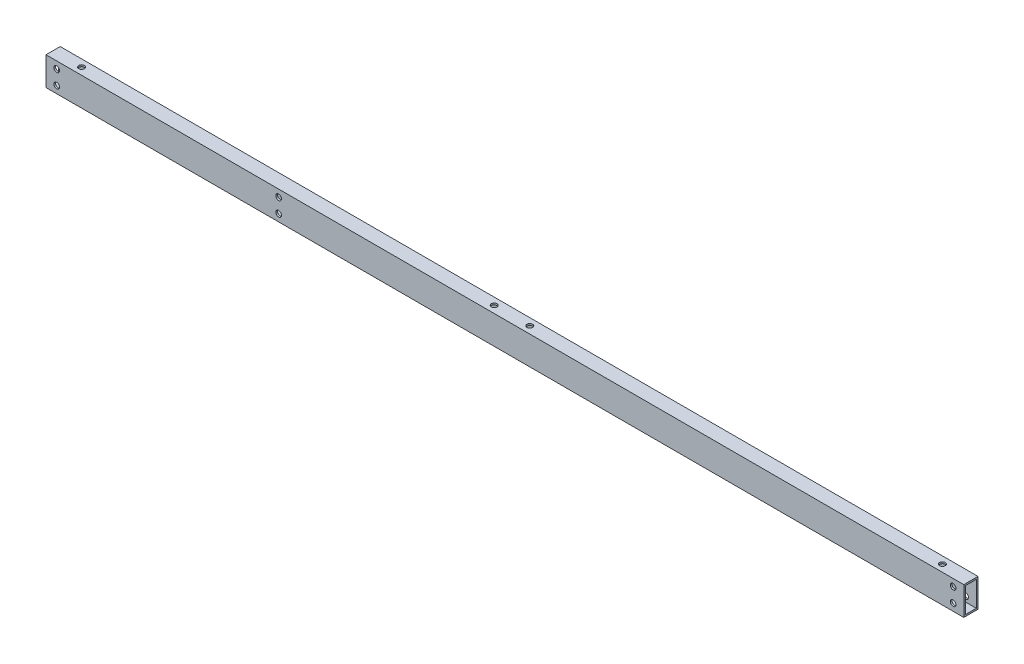
ISO-10303-21;
HEADER;
FILE_DESCRIPTION(('STEP AP214'),'2;1');
FILE_NAME('part.step','',(''),(''),'','','');
FILE_SCHEMA(('AUTOMOTIVE_DESIGN { 1 0 10303 214 1 1 1 1 }'));
ENDSEC;
DATA;
#1=APPLICATION_CONTEXT('core data for automotive mechanical design processes');
#2=APPLICATION_PROTOCOL_DEFINITION('international standard','automotive_design',2000,#1);
#3=PRODUCT_CONTEXT('',#1,'mechanical');
#4=PRODUCT('Part','Part','',(#3));
#5=PRODUCT_RELATED_PRODUCT_CATEGORY('part','',(#4));
#6=PRODUCT_DEFINITION_FORMATION('','',#4);
#7=PRODUCT_DEFINITION_CONTEXT('part definition',#1,'design');
#8=PRODUCT_DEFINITION('design','',#6,#7);
#9=PRODUCT_DEFINITION_SHAPE('','',#8);
#10=(LENGTH_UNIT() NAMED_UNIT(*) SI_UNIT(.MILLI.,.METRE.));
#11=(NAMED_UNIT(*) PLANE_ANGLE_UNIT() SI_UNIT($,.RADIAN.));
#12=(NAMED_UNIT(*) SI_UNIT($,.STERADIAN.) SOLID_ANGLE_UNIT());
#13=UNCERTAINTY_MEASURE_WITH_UNIT(LENGTH_MEASURE(1.E-05),#10,'distance_accuracy_value','');
#14=(GEOMETRIC_REPRESENTATION_CONTEXT(3) GLOBAL_UNCERTAINTY_ASSIGNED_CONTEXT((#13)) GLOBAL_UNIT_ASSIGNED_CONTEXT((#10,
#11,#12)) REPRESENTATION_CONTEXT('',''));
#15=CARTESIAN_POINT('',(0.,0.,0.));
#16=DIRECTION('',(0.,0.,1.));
#17=DIRECTION('',(1.,0.,0.));
#18=AXIS2_PLACEMENT_3D('',#15,#16,#17);
#19=CARTESIAN_POINT('',(645.,0.,0.));
#20=DIRECTION('',(1.,0.,0.));
#21=DIRECTION('',(0.,0.,-1.));
#22=AXIS2_PLACEMENT_3D('',#19,#20,#21);
#23=PLANE('',#22);
#24=DIRECTION('',(0.,1.,0.));
#25=VECTOR('',#24,1.);
#26=CARTESIAN_POINT('',(645.,10.,-5.));
#27=LINE('',#26,#25);
#28=CARTESIAN_POINT('',(645.,-10.,-5.));
#29=VERTEX_POINT('',#28);
#30=CARTESIAN_POINT('',(645.,10.,-5.));
#31=VERTEX_POINT('',#30);
#32=EDGE_CURVE('E181',#29,#31,#27,.T.);
#33=ORIENTED_EDGE('',*,*,#32,.T.);
#34=DIRECTION('',(0.,0.,1.));
#35=VECTOR('',#34,1.);
#36=CARTESIAN_POINT('',(645.,10.,5.));
#37=LINE('',#36,#35);
#38=CARTESIAN_POINT('',(645.,10.,5.));
#39=VERTEX_POINT('',#38);
#40=EDGE_CURVE('E185',#31,#39,#37,.T.);
#41=ORIENTED_EDGE('',*,*,#40,.T.);
#42=DIRECTION('',(0.,-1.,0.));
#43=VECTOR('',#42,1.);
#44=CARTESIAN_POINT('',(645.,10.,5.));
#45=LINE('',#44,#43);
#46=CARTESIAN_POINT('',(645.,-10.,5.));
#47=VERTEX_POINT('',#46);
#48=EDGE_CURVE('E189',#39,#47,#45,.T.);
#49=ORIENTED_EDGE('',*,*,#48,.T.);
#50=DIRECTION('',(0.,0.,-1.));
#51=VECTOR('',#50,1.);
#52=CARTESIAN_POINT('',(645.,-10.,5.));
#53=LINE('',#52,#51);
#54=EDGE_CURVE('E192',#47,#29,#53,.T.);
#55=ORIENTED_EDGE('',*,*,#54,.T.);
#56=EDGE_LOOP('',(#33,#41,#49,#55));
#57=FACE_BOUND('',#56,.T.);
#58=DIRECTION('',(0.,0.,1.));
#59=VECTOR('',#58,1.);
#60=CARTESIAN_POINT('',(645.,8.8,5.));
#61=LINE('',#60,#59);
#62=CARTESIAN_POINT('',(645.,8.8,-3.8));
#63=VERTEX_POINT('',#62);
#64=CARTESIAN_POINT('',(645.,8.8,3.8));
#65=VERTEX_POINT('',#64);
#66=EDGE_CURVE('E140',#63,#65,#61,.T.);
#67=ORIENTED_EDGE('',*,*,#66,.F.);
#68=DIRECTION('',(0.,1.,0.));
#69=VECTOR('',#68,1.);
#70=CARTESIAN_POINT('',(645.,10.,-3.8));
#71=LINE('',#70,#69);
#72=CARTESIAN_POINT('',(645.,-8.8,-3.8));
#73=VERTEX_POINT('',#72);
#74=EDGE_CURVE('E131',#73,#63,#71,.T.);
#75=ORIENTED_EDGE('',*,*,#74,.F.);
#76=DIRECTION('',(0.,0.,-1.));
#77=VECTOR('',#76,1.);
#78=CARTESIAN_POINT('',(645.,-8.8,5.));
#79=LINE('',#78,#77);
#80=CARTESIAN_POINT('',(645.,-8.8,3.8));
#81=VERTEX_POINT('',#80);
#82=EDGE_CURVE('E157',#81,#73,#79,.T.);
#83=ORIENTED_EDGE('',*,*,#82,.F.);
#84=DIRECTION('',(0.,-1.,0.));
#85=VECTOR('',#84,1.);
#86=CARTESIAN_POINT('',(645.,10.,3.8));
#87=LINE('',#86,#85);
#88=EDGE_CURVE('E153',#65,#81,#87,.T.);
#89=ORIENTED_EDGE('',*,*,#88,.F.);
#90=EDGE_LOOP('',(#67,#75,#83,#89));
#91=FACE_BOUND('',#90,.T.);
#92=ADVANCED_FACE('F63',(#57,#91),#23,.T.);
#93=CARTESIAN_POINT('',(0.,0.,0.));
#94=DIRECTION('',(1.,0.,0.));
#95=DIRECTION('',(0.,0.,-1.));
#96=AXIS2_PLACEMENT_3D('',#93,#94,#95);
#97=PLANE('',#96);
#98=DIRECTION('',(0.,1.,0.));
#99=VECTOR('',#98,1.);
#100=CARTESIAN_POINT('',(0.,10.,-5.));
#101=LINE('',#100,#99);
#102=CARTESIAN_POINT('',(0.,-10.,-5.));
#103=VERTEX_POINT('',#102);
#104=CARTESIAN_POINT('',(0.,10.,-5.));
#105=VERTEX_POINT('',#104);
#106=EDGE_CURVE('E149',#103,#105,#101,.T.);
#107=ORIENTED_EDGE('',*,*,#106,.F.);
#108=DIRECTION('',(0.,0.,-1.));
#109=VECTOR('',#108,1.);
#110=CARTESIAN_POINT('',(0.,-10.,5.));
#111=LINE('',#110,#109);
#112=CARTESIAN_POINT('',(0.,-10.,5.));
#113=VERTEX_POINT('',#112);
#114=EDGE_CURVE('E186',#113,#103,#111,.T.);
#115=ORIENTED_EDGE('',*,*,#114,.F.);
#116=DIRECTION('',(0.,-1.,0.));
#117=VECTOR('',#116,1.);
#118=CARTESIAN_POINT('',(0.,10.,5.));
#119=LINE('',#118,#117);
#120=CARTESIAN_POINT('',(0.,10.,5.));
#121=VERTEX_POINT('',#120);
#122=EDGE_CURVE('E202',#121,#113,#119,.T.);
#123=ORIENTED_EDGE('',*,*,#122,.F.);
#124=DIRECTION('',(0.,0.,1.));
#125=VECTOR('',#124,1.);
#126=CARTESIAN_POINT('',(0.,10.,5.));
#127=LINE('',#126,#125);
#128=EDGE_CURVE('E199',#105,#121,#127,.T.);
#129=ORIENTED_EDGE('',*,*,#128,.F.);
#130=EDGE_LOOP('',(#107,#115,#123,#129));
#131=FACE_BOUND('',#130,.T.);
#132=DIRECTION('',(0.,1.,0.));
#133=VECTOR('',#132,1.);
#134=CARTESIAN_POINT('',(0.,10.,-3.8));
#135=LINE('',#134,#133);
#136=CARTESIAN_POINT('',(0.,-8.8,-3.8));
#137=VERTEX_POINT('',#136);
#138=CARTESIAN_POINT('',(0.,8.8,-3.8));
#139=VERTEX_POINT('',#138);
#140=EDGE_CURVE('E89',#137,#139,#135,.T.);
#141=ORIENTED_EDGE('',*,*,#140,.T.);
#142=DIRECTION('',(0.,0.,1.));
#143=VECTOR('',#142,1.);
#144=CARTESIAN_POINT('',(0.,8.8,5.));
#145=LINE('',#144,#143);
#146=CARTESIAN_POINT('',(0.,8.8,3.8));
#147=VERTEX_POINT('',#146);
#148=EDGE_CURVE('E147',#139,#147,#145,.T.);
#149=ORIENTED_EDGE('',*,*,#148,.T.);
#150=DIRECTION('',(0.,-1.,0.));
#151=VECTOR('',#150,1.);
#152=CARTESIAN_POINT('',(0.,10.,3.8));
#153=LINE('',#152,#151);
#154=CARTESIAN_POINT('',(0.,-8.8,3.8));
#155=VERTEX_POINT('',#154);
#156=EDGE_CURVE('E168',#147,#155,#153,.T.);
#157=ORIENTED_EDGE('',*,*,#156,.T.);
#158=DIRECTION('',(0.,0.,-1.));
#159=VECTOR('',#158,1.);
#160=CARTESIAN_POINT('',(0.,-8.8,5.));
#161=LINE('',#160,#159);
#162=EDGE_CURVE('E141',#155,#137,#161,.T.);
#163=ORIENTED_EDGE('',*,*,#162,.T.);
#164=EDGE_LOOP('',(#141,#149,#157,#163));
#165=FACE_BOUND('',#164,.T.);
#166=ADVANCED_FACE('F372',(#131,#165),#97,.F.);
#167=CARTESIAN_POINT('',(645.,10.,-5.));
#168=DIRECTION('',(0.,0.,1.));
#169=DIRECTION('',(0.,-1.,0.));
#170=AXIS2_PLACEMENT_3D('',#167,#168,#169);
#171=PLANE('',#170);
#172=CARTESIAN_POINT('',(163.5,4.99999999999994,-5.));
#173=DIRECTION('',(0.,0.,1.));
#174=DIRECTION('',(-1.,0.,0.));
#175=AXIS2_PLACEMENT_3D('',#172,#173,#174);
#176=CIRCLE('',#175,2.);
#177=CARTESIAN_POINT('',(161.5,4.99999999999994,-5.));
#178=VERTEX_POINT('',#177);
#179=EDGE_CURVE('E287',#178,#178,#176,.T.);
#180=ORIENTED_EDGE('',*,*,#179,.T.);
#181=EDGE_LOOP('',(#180));
#182=FACE_BOUND('',#181,.T.);
#183=CARTESIAN_POINT('',(637.5,5.,-5.));
#184=DIRECTION('',(0.,0.,1.));
#185=DIRECTION('',(1.,0.,0.));
#186=AXIS2_PLACEMENT_3D('',#183,#184,#185);
#187=CIRCLE('',#186,2.);
#188=CARTESIAN_POINT('',(639.5,5.,-5.));
#189=VERTEX_POINT('',#188);
#190=EDGE_CURVE('E296',#189,#189,#187,.T.);
#191=ORIENTED_EDGE('',*,*,#190,.T.);
#192=EDGE_LOOP('',(#191));
#193=FACE_BOUND('',#192,.T.);
#194=CARTESIAN_POINT('',(637.5,-5.,-5.));
#195=DIRECTION('',(0.,0.,1.));
#196=DIRECTION('',(-1.,0.,0.));
#197=AXIS2_PLACEMENT_3D('',#194,#195,#196);
#198=CIRCLE('',#197,2.);
#199=CARTESIAN_POINT('',(635.5,-5.,-5.));
#200=VERTEX_POINT('',#199);
#201=EDGE_CURVE('E304',#200,#200,#198,.T.);
#202=ORIENTED_EDGE('',*,*,#201,.T.);
#203=EDGE_LOOP('',(#202));
#204=FACE_BOUND('',#203,.T.);
#205=CARTESIAN_POINT('',(7.49999999999995,-5.00000000000008,-5.));
#206=DIRECTION('',(0.,0.,1.));
#207=DIRECTION('',(1.,0.,0.));
#208=AXIS2_PLACEMENT_3D('',#205,#206,#207);
#209=CIRCLE('',#208,2.);
#210=CARTESIAN_POINT('',(9.49999999999995,-5.00000000000008,-5.));
#211=VERTEX_POINT('',#210);
#212=EDGE_CURVE('E312',#211,#211,#209,.T.);
#213=ORIENTED_EDGE('',*,*,#212,.T.);
#214=EDGE_LOOP('',(#213));
#215=FACE_BOUND('',#214,.T.);
#216=CARTESIAN_POINT('',(7.49999999999995,4.99999999999992,-5.));
#217=DIRECTION('',(0.,0.,1.));
#218=DIRECTION('',(-1.,0.,0.));
#219=AXIS2_PLACEMENT_3D('',#216,#217,#218);
#220=CIRCLE('',#219,2.);
#221=CARTESIAN_POINT('',(5.49999999999995,4.99999999999992,-5.));
#222=VERTEX_POINT('',#221);
#223=EDGE_CURVE('E279',#222,#222,#220,.T.);
#224=ORIENTED_EDGE('',*,*,#223,.T.);
#225=EDGE_LOOP('',(#224));
#226=FACE_BOUND('',#225,.T.);
#227=CARTESIAN_POINT('',(163.5,-5.00000000000006,-5.));
#228=DIRECTION('',(0.,0.,1.));
#229=DIRECTION('',(1.,0.,0.));
#230=AXIS2_PLACEMENT_3D('',#227,#228,#229);
#231=CIRCLE('',#230,2.);
#232=CARTESIAN_POINT('',(165.5,-5.00000000000006,-5.));
#233=VERTEX_POINT('',#232);
#234=EDGE_CURVE('E222',#233,#233,#231,.T.);
#235=ORIENTED_EDGE('',*,*,#234,.T.);
#236=EDGE_LOOP('',(#235));
#237=FACE_BOUND('',#236,.T.);
#238=ORIENTED_EDGE('',*,*,#106,.T.);
#239=DIRECTION('',(-1.,0.,0.));
#240=VECTOR('',#239,1.);
#241=CARTESIAN_POINT('',(645.,10.,-5.));
#242=LINE('',#241,#240);
#243=EDGE_CURVE('E12',#31,#105,#242,.T.);
#244=ORIENTED_EDGE('',*,*,#243,.F.);
#245=ORIENTED_EDGE('',*,*,#32,.F.);
#246=DIRECTION('',(-1.,0.,0.));
#247=VECTOR('',#246,1.);
#248=CARTESIAN_POINT('',(645.,-10.,-5.));
#249=LINE('',#248,#247);
#250=EDGE_CURVE('E195',#29,#103,#249,.T.);
#251=ORIENTED_EDGE('',*,*,#250,.T.);
#252=EDGE_LOOP('',(#238,#244,#245,#251));
#253=FACE_BOUND('',#252,.T.);
#254=ADVANCED_FACE('F65',(#182,#193,#204,#215,#226,#237,#253),#171,.F.);
#255=CARTESIAN_POINT('',(645.,10.,5.));
#256=DIRECTION('',(0.,-1.,0.));
#257=DIRECTION('',(0.,0.,-1.));
#258=AXIS2_PLACEMENT_3D('',#255,#256,#257);
#259=PLANE('',#258);
#260=CARTESIAN_POINT('',(20.,10.,0.));
#261=DIRECTION('',(0.,1.,0.));
#262=DIRECTION('',(0.,0.,1.));
#263=AXIS2_PLACEMENT_3D('',#260,#261,#262);
#264=CIRCLE('',#263,2.);
#265=CARTESIAN_POINT('',(20.,10.,2.));
#266=VERTEX_POINT('',#265);
#267=EDGE_CURVE('E479',#266,#266,#264,.T.);
#268=ORIENTED_EDGE('',*,*,#267,.F.);
#269=EDGE_LOOP('',(#268));
#270=FACE_BOUND('',#269,.T.);
#271=CARTESIAN_POINT('',(335.,10.,0.));
#272=DIRECTION('',(0.,1.,0.));
#273=DIRECTION('',(0.,0.,-1.));
#274=AXIS2_PLACEMENT_3D('',#271,#272,#273);
#275=CIRCLE('',#274,2.);
#276=CARTESIAN_POINT('',(335.,10.,-2.00000000000006));
#277=VERTEX_POINT('',#276);
#278=EDGE_CURVE('E496',#277,#277,#275,.T.);
#279=ORIENTED_EDGE('',*,*,#278,.F.);
#280=EDGE_LOOP('',(#279));
#281=FACE_BOUND('',#280,.T.);
#282=CARTESIAN_POINT('',(310.,10.,0.));
#283=DIRECTION('',(0.,1.,0.));
#284=DIRECTION('',(0.,0.,1.));
#285=AXIS2_PLACEMENT_3D('',#282,#283,#284);
#286=CIRCLE('',#285,2.);
#287=CARTESIAN_POINT('',(310.,10.,1.99999999999993));
#288=VERTEX_POINT('',#287);
#289=EDGE_CURVE('E495',#288,#288,#286,.T.);
#290=ORIENTED_EDGE('',*,*,#289,.F.);
#291=EDGE_LOOP('',(#290));
#292=FACE_BOUND('',#291,.T.);
#293=CARTESIAN_POINT('',(625.,10.,0.));
#294=DIRECTION('',(0.,1.,0.));
#295=DIRECTION('',(0.,0.,-1.));
#296=AXIS2_PLACEMENT_3D('',#293,#294,#295);
#297=CIRCLE('',#296,2.);
#298=CARTESIAN_POINT('',(625.,10.,-2.00000000000007));
#299=VERTEX_POINT('',#298);
#300=EDGE_CURVE('E488',#299,#299,#297,.T.);
#301=ORIENTED_EDGE('',*,*,#300,.F.);
#302=EDGE_LOOP('',(#301));
#303=FACE_BOUND('',#302,.T.);
#304=ORIENTED_EDGE('',*,*,#128,.T.);
#305=DIRECTION('',(-1.,0.,0.));
#306=VECTOR('',#305,1.);
#307=CARTESIAN_POINT('',(645.,10.,5.));
#308=LINE('',#307,#306);
#309=EDGE_CURVE('E73',#39,#121,#308,.T.);
#310=ORIENTED_EDGE('',*,*,#309,.F.);
#311=ORIENTED_EDGE('',*,*,#40,.F.);
#312=ORIENTED_EDGE('',*,*,#243,.T.);
#313=EDGE_LOOP('',(#304,#310,#311,#312));
#314=FACE_BOUND('',#313,.T.);
#315=ADVANCED_FACE('F371',(#270,#281,#292,#303,#314),#259,.F.);
#316=CARTESIAN_POINT('',(645.,10.,5.));
#317=DIRECTION('',(0.,0.,-1.));
#318=DIRECTION('',(0.,1.,0.));
#319=AXIS2_PLACEMENT_3D('',#316,#317,#318);
#320=PLANE('',#319);
#321=CARTESIAN_POINT('',(163.5,4.99999999999994,5.));
#322=DIRECTION('',(0.,0.,1.));
#323=DIRECTION('',(-1.,0.,0.));
#324=AXIS2_PLACEMENT_3D('',#321,#322,#323);
#325=CIRCLE('',#324,2.);
#326=CARTESIAN_POINT('',(161.5,4.99999999999994,5.));
#327=VERTEX_POINT('',#326);
#328=EDGE_CURVE('E292',#327,#327,#325,.T.);
#329=ORIENTED_EDGE('',*,*,#328,.F.);
#330=EDGE_LOOP('',(#329));
#331=FACE_BOUND('',#330,.T.);
#332=CARTESIAN_POINT('',(637.5,5.,5.));
#333=DIRECTION('',(0.,0.,1.));
#334=DIRECTION('',(1.,0.,0.));
#335=AXIS2_PLACEMENT_3D('',#332,#333,#334);
#336=CIRCLE('',#335,2.);
#337=CARTESIAN_POINT('',(639.5,5.,5.));
#338=VERTEX_POINT('',#337);
#339=EDGE_CURVE('E300',#338,#338,#336,.T.);
#340=ORIENTED_EDGE('',*,*,#339,.F.);
#341=EDGE_LOOP('',(#340));
#342=FACE_BOUND('',#341,.T.);
#343=CARTESIAN_POINT('',(637.5,-5.,5.));
#344=DIRECTION('',(0.,0.,1.));
#345=DIRECTION('',(-1.,0.,0.));
#346=AXIS2_PLACEMENT_3D('',#343,#344,#345);
#347=CIRCLE('',#346,2.);
#348=CARTESIAN_POINT('',(635.5,-5.,5.));
#349=VERTEX_POINT('',#348);
#350=EDGE_CURVE('E308',#349,#349,#347,.T.);
#351=ORIENTED_EDGE('',*,*,#350,.F.);
#352=EDGE_LOOP('',(#351));
#353=FACE_BOUND('',#352,.T.);
#354=CARTESIAN_POINT('',(7.49999999999995,-5.00000000000008,5.));
#355=DIRECTION('',(0.,0.,1.));
#356=DIRECTION('',(1.,0.,0.));
#357=AXIS2_PLACEMENT_3D('',#354,#355,#356);
#358=CIRCLE('',#357,2.);
#359=CARTESIAN_POINT('',(9.49999999999995,-5.00000000000008,5.));
#360=VERTEX_POINT('',#359);
#361=EDGE_CURVE('E283',#360,#360,#358,.T.);
#362=ORIENTED_EDGE('',*,*,#361,.F.);
#363=EDGE_LOOP('',(#362));
#364=FACE_BOUND('',#363,.T.);
#365=CARTESIAN_POINT('',(7.49999999999995,4.99999999999992,5.));
#366=DIRECTION('',(0.,0.,1.));
#367=DIRECTION('',(-1.,0.,0.));
#368=AXIS2_PLACEMENT_3D('',#365,#366,#367);
#369=CIRCLE('',#368,2.);
#370=CARTESIAN_POINT('',(5.49999999999995,4.99999999999992,5.));
#371=VERTEX_POINT('',#370);
#372=EDGE_CURVE('E278',#371,#371,#369,.T.);
#373=ORIENTED_EDGE('',*,*,#372,.F.);
#374=EDGE_LOOP('',(#373));
#375=FACE_BOUND('',#374,.T.);
#376=CARTESIAN_POINT('',(163.5,-5.00000000000006,5.));
#377=DIRECTION('',(0.,0.,1.));
#378=DIRECTION('',(1.,0.,0.));
#379=AXIS2_PLACEMENT_3D('',#376,#377,#378);
#380=CIRCLE('',#379,2.);
#381=CARTESIAN_POINT('',(165.5,-5.00000000000006,5.));
#382=VERTEX_POINT('',#381);
#383=EDGE_CURVE('E291',#382,#382,#380,.T.);
#384=ORIENTED_EDGE('',*,*,#383,.F.);
#385=EDGE_LOOP('',(#384));
#386=FACE_BOUND('',#385,.T.);
#387=ORIENTED_EDGE('',*,*,#122,.T.);
#388=DIRECTION('',(-1.,0.,0.));
#389=VECTOR('',#388,1.);
#390=CARTESIAN_POINT('',(645.,-10.,5.));
#391=LINE('',#390,#389);
#392=EDGE_CURVE('E210',#47,#113,#391,.T.);
#393=ORIENTED_EDGE('',*,*,#392,.F.);
#394=ORIENTED_EDGE('',*,*,#48,.F.);
#395=ORIENTED_EDGE('',*,*,#309,.T.);
#396=EDGE_LOOP('',(#387,#393,#394,#395));
#397=FACE_BOUND('',#396,.T.);
#398=ADVANCED_FACE('F390',(#331,#342,#353,#364,#375,#386,#397),#320,.F.);
#399=CARTESIAN_POINT('',(645.,-10.,5.));
#400=DIRECTION('',(0.,1.,0.));
#401=DIRECTION('',(0.,0.,1.));
#402=AXIS2_PLACEMENT_3D('',#399,#400,#401);
#403=PLANE('',#402);
#404=CARTESIAN_POINT('',(20.,-10.,0.));
#405=DIRECTION('',(0.,1.,0.));
#406=DIRECTION('',(0.,0.,1.));
#407=AXIS2_PLACEMENT_3D('',#404,#405,#406);
#408=CIRCLE('',#407,2.);
#409=CARTESIAN_POINT('',(20.,-10.,2.));
#410=VERTEX_POINT('',#409);
#411=EDGE_CURVE('E252',#410,#410,#408,.T.);
#412=ORIENTED_EDGE('',*,*,#411,.T.);
#413=EDGE_LOOP('',(#412));
#414=FACE_BOUND('',#413,.T.);
#415=CARTESIAN_POINT('',(335.,-10.,0.));
#416=DIRECTION('',(0.,1.,0.));
#417=DIRECTION('',(0.,0.,-1.));
#418=AXIS2_PLACEMENT_3D('',#415,#416,#417);
#419=CIRCLE('',#418,2.);
#420=CARTESIAN_POINT('',(335.,-10.,-2.00000000000006));
#421=VERTEX_POINT('',#420);
#422=EDGE_CURVE('E491',#421,#421,#419,.T.);
#423=ORIENTED_EDGE('',*,*,#422,.T.);
#424=EDGE_LOOP('',(#423));
#425=FACE_BOUND('',#424,.T.);
#426=CARTESIAN_POINT('',(310.,-10.,0.));
#427=DIRECTION('',(0.,1.,0.));
#428=DIRECTION('',(0.,0.,1.));
#429=AXIS2_PLACEMENT_3D('',#426,#427,#428);
#430=CIRCLE('',#429,2.);
#431=CARTESIAN_POINT('',(310.,-10.,1.99999999999993));
#432=VERTEX_POINT('',#431);
#433=EDGE_CURVE('E503',#432,#432,#430,.T.);
#434=ORIENTED_EDGE('',*,*,#433,.T.);
#435=EDGE_LOOP('',(#434));
#436=FACE_BOUND('',#435,.T.);
#437=CARTESIAN_POINT('',(625.,-10.,0.));
#438=DIRECTION('',(0.,1.,0.));
#439=DIRECTION('',(0.,0.,-1.));
#440=AXIS2_PLACEMENT_3D('',#437,#438,#439);
#441=CIRCLE('',#440,2.);
#442=CARTESIAN_POINT('',(625.,-10.,-2.00000000000007));
#443=VERTEX_POINT('',#442);
#444=EDGE_CURVE('E481',#443,#443,#441,.T.);
#445=ORIENTED_EDGE('',*,*,#444,.T.);
#446=EDGE_LOOP('',(#445));
#447=FACE_BOUND('',#446,.T.);
#448=ORIENTED_EDGE('',*,*,#114,.T.);
#449=ORIENTED_EDGE('',*,*,#250,.F.);
#450=ORIENTED_EDGE('',*,*,#54,.F.);
#451=ORIENTED_EDGE('',*,*,#392,.T.);
#452=EDGE_LOOP('',(#448,#449,#450,#451));
#453=FACE_BOUND('',#452,.T.);
#454=ADVANCED_FACE('F348',(#414,#425,#436,#447,#453),#403,.F.);
#455=CARTESIAN_POINT('',(645.,10.,-3.8));
#456=DIRECTION('',(0.,0.,1.));
#457=DIRECTION('',(0.,-1.,0.));
#458=AXIS2_PLACEMENT_3D('',#455,#456,#457);
#459=PLANE('',#458);
#460=CARTESIAN_POINT('',(163.5,4.99999999999994,-3.8));
#461=DIRECTION('',(0.,0.,1.));
#462=DIRECTION('',(0.,-1.,0.));
#463=AXIS2_PLACEMENT_3D('',#460,#461,#462);
#464=CIRCLE('',#463,2.);
#465=CARTESIAN_POINT('',(163.5,2.99999999999994,-3.8));
#466=VERTEX_POINT('',#465);
#467=EDGE_CURVE('E165',#466,#466,#464,.T.);
#468=ORIENTED_EDGE('',*,*,#467,.F.);
#469=EDGE_LOOP('',(#468));
#470=FACE_BOUND('',#469,.T.);
#471=CARTESIAN_POINT('',(637.5,5.,-3.8));
#472=DIRECTION('',(0.,0.,1.));
#473=DIRECTION('',(0.,-1.,0.));
#474=AXIS2_PLACEMENT_3D('',#471,#472,#473);
#475=CIRCLE('',#474,2.);
#476=CARTESIAN_POINT('',(637.5,3.,-3.8));
#477=VERTEX_POINT('',#476);
#478=EDGE_CURVE('E242',#477,#477,#475,.T.);
#479=ORIENTED_EDGE('',*,*,#478,.F.);
#480=EDGE_LOOP('',(#479));
#481=FACE_BOUND('',#480,.T.);
#482=CARTESIAN_POINT('',(637.5,-5.,-3.8));
#483=DIRECTION('',(0.,0.,1.));
#484=DIRECTION('',(0.,-1.,0.));
#485=AXIS2_PLACEMENT_3D('',#482,#483,#484);
#486=CIRCLE('',#485,2.);
#487=CARTESIAN_POINT('',(637.5,-7.,-3.8));
#488=VERTEX_POINT('',#487);
#489=EDGE_CURVE('E237',#488,#488,#486,.T.);
#490=ORIENTED_EDGE('',*,*,#489,.F.);
#491=EDGE_LOOP('',(#490));
#492=FACE_BOUND('',#491,.T.);
#493=CARTESIAN_POINT('',(7.49999999999995,-5.00000000000008,-3.8));
#494=DIRECTION('',(0.,0.,1.));
#495=DIRECTION('',(0.,-1.,0.));
#496=AXIS2_PLACEMENT_3D('',#493,#494,#495);
#497=CIRCLE('',#496,2.);
#498=CARTESIAN_POINT('',(7.49999999999995,-7.00000000000008,-3.8));
#499=VERTEX_POINT('',#498);
#500=EDGE_CURVE('E232',#499,#499,#497,.T.);
#501=ORIENTED_EDGE('',*,*,#500,.F.);
#502=EDGE_LOOP('',(#501));
#503=FACE_BOUND('',#502,.T.);
#504=CARTESIAN_POINT('',(7.49999999999995,4.99999999999992,-3.8));
#505=DIRECTION('',(0.,0.,1.));
#506=DIRECTION('',(0.,-1.,0.));
#507=AXIS2_PLACEMENT_3D('',#504,#505,#506);
#508=CIRCLE('',#507,2.);
#509=CARTESIAN_POINT('',(7.49999999999995,2.99999999999992,-3.8));
#510=VERTEX_POINT('',#509);
#511=EDGE_CURVE('E227',#510,#510,#508,.T.);
#512=ORIENTED_EDGE('',*,*,#511,.F.);
#513=EDGE_LOOP('',(#512));
#514=FACE_BOUND('',#513,.T.);
#515=CARTESIAN_POINT('',(163.5,-5.00000000000006,-3.8));
#516=DIRECTION('',(0.,0.,1.));
#517=DIRECTION('',(0.,-1.,0.));
#518=AXIS2_PLACEMENT_3D('',#515,#516,#517);
#519=CIRCLE('',#518,2.);
#520=CARTESIAN_POINT('',(163.5,-7.00000000000006,-3.8));
#521=VERTEX_POINT('',#520);
#522=EDGE_CURVE('E221',#521,#521,#519,.T.);
#523=ORIENTED_EDGE('',*,*,#522,.F.);
#524=EDGE_LOOP('',(#523));
#525=FACE_BOUND('',#524,.T.);
#526=ORIENTED_EDGE('',*,*,#140,.F.);
#527=DIRECTION('',(-1.,0.,0.));
#528=VECTOR('',#527,1.);
#529=CARTESIAN_POINT('',(645.,-8.8,-3.8));
#530=LINE('',#529,#528);
#531=EDGE_CURVE('E135',#73,#137,#530,.T.);
#532=ORIENTED_EDGE('',*,*,#531,.F.);
#533=ORIENTED_EDGE('',*,*,#74,.T.);
#534=DIRECTION('',(-1.,0.,0.));
#535=VECTOR('',#534,1.);
#536=CARTESIAN_POINT('',(645.,8.8,-3.8));
#537=LINE('',#536,#535);
#538=EDGE_CURVE('E134',#63,#139,#537,.T.);
#539=ORIENTED_EDGE('',*,*,#538,.T.);
#540=EDGE_LOOP('',(#526,#532,#533,#539));
#541=FACE_BOUND('',#540,.T.);
#542=ADVANCED_FACE('F133',(#470,#481,#492,#503,#514,#525,#541),#459,.T.);
#543=CARTESIAN_POINT('',(645.,8.8,5.));
#544=DIRECTION('',(0.,-1.,0.));
#545=DIRECTION('',(0.,0.,-1.));
#546=AXIS2_PLACEMENT_3D('',#543,#544,#545);
#547=PLANE('',#546);
#548=CARTESIAN_POINT('',(20.,8.8,0.));
#549=DIRECTION('',(0.,-1.,0.));
#550=DIRECTION('',(0.,0.,-1.));
#551=AXIS2_PLACEMENT_3D('',#548,#549,#550);
#552=CIRCLE('',#551,2.);
#553=CARTESIAN_POINT('',(20.,8.8,-2.));
#554=VERTEX_POINT('',#553);
#555=EDGE_CURVE('E274',#554,#554,#552,.T.);
#556=ORIENTED_EDGE('',*,*,#555,.F.);
#557=EDGE_LOOP('',(#556));
#558=FACE_BOUND('',#557,.T.);
#559=CARTESIAN_POINT('',(335.,8.8,0.));
#560=DIRECTION('',(0.,-1.,0.));
#561=DIRECTION('',(0.,0.,-1.));
#562=AXIS2_PLACEMENT_3D('',#559,#560,#561);
#563=CIRCLE('',#562,2.);
#564=CARTESIAN_POINT('',(335.,8.8,-2.00000000000006));
#565=VERTEX_POINT('',#564);
#566=EDGE_CURVE('E260',#565,#565,#563,.T.);
#567=ORIENTED_EDGE('',*,*,#566,.F.);
#568=EDGE_LOOP('',(#567));
#569=FACE_BOUND('',#568,.T.);
#570=CARTESIAN_POINT('',(310.,8.8,0.));
#571=DIRECTION('',(0.,-1.,0.));
#572=DIRECTION('',(0.,0.,-1.));
#573=AXIS2_PLACEMENT_3D('',#570,#571,#572);
#574=CIRCLE('',#573,2.);
#575=CARTESIAN_POINT('',(310.,8.8,-2.00000000000006));
#576=VERTEX_POINT('',#575);
#577=EDGE_CURVE('E256',#576,#576,#574,.T.);
#578=ORIENTED_EDGE('',*,*,#577,.F.);
#579=EDGE_LOOP('',(#578));
#580=FACE_BOUND('',#579,.T.);
#581=CARTESIAN_POINT('',(625.,8.8,0.));
#582=DIRECTION('',(0.,-1.,0.));
#583=DIRECTION('',(0.,0.,-1.));
#584=AXIS2_PLACEMENT_3D('',#581,#582,#583);
#585=CIRCLE('',#584,2.);
#586=CARTESIAN_POINT('',(625.,8.8,-2.00000000000007));
#587=VERTEX_POINT('',#586);
#588=EDGE_CURVE('E251',#587,#587,#585,.T.);
#589=ORIENTED_EDGE('',*,*,#588,.F.);
#590=EDGE_LOOP('',(#589));
#591=FACE_BOUND('',#590,.T.);
#592=ORIENTED_EDGE('',*,*,#148,.F.);
#593=ORIENTED_EDGE('',*,*,#538,.F.);
#594=ORIENTED_EDGE('',*,*,#66,.T.);
#595=DIRECTION('',(-1.,0.,0.));
#596=VECTOR('',#595,1.);
#597=CARTESIAN_POINT('',(645.,8.8,3.8));
#598=LINE('',#597,#596);
#599=EDGE_CURVE('E150',#65,#147,#598,.T.);
#600=ORIENTED_EDGE('',*,*,#599,.T.);
#601=EDGE_LOOP('',(#592,#593,#594,#600));
#602=FACE_BOUND('',#601,.T.);
#603=ADVANCED_FACE('F144',(#558,#569,#580,#591,#602),#547,.T.);
#604=CARTESIAN_POINT('',(645.,10.,3.8));
#605=DIRECTION('',(0.,0.,-1.));
#606=DIRECTION('',(0.,1.,0.));
#607=AXIS2_PLACEMENT_3D('',#604,#605,#606);
#608=PLANE('',#607);
#609=CARTESIAN_POINT('',(163.5,4.99999999999994,3.8));
#610=DIRECTION('',(0.,0.,-1.));
#611=DIRECTION('',(0.,1.,0.));
#612=AXIS2_PLACEMENT_3D('',#609,#610,#611);
#613=CIRCLE('',#612,2.);
#614=CARTESIAN_POINT('',(163.5,6.99999999999993,3.8));
#615=VERTEX_POINT('',#614);
#616=EDGE_CURVE('E243',#615,#615,#613,.T.);
#617=ORIENTED_EDGE('',*,*,#616,.F.);
#618=EDGE_LOOP('',(#617));
#619=FACE_BOUND('',#618,.T.);
#620=CARTESIAN_POINT('',(637.5,5.,3.8));
#621=DIRECTION('',(0.,0.,-1.));
#622=DIRECTION('',(0.,1.,0.));
#623=AXIS2_PLACEMENT_3D('',#620,#621,#622);
#624=CIRCLE('',#623,2.);
#625=CARTESIAN_POINT('',(637.5,7.,3.8));
#626=VERTEX_POINT('',#625);
#627=EDGE_CURVE('E238',#626,#626,#624,.T.);
#628=ORIENTED_EDGE('',*,*,#627,.F.);
#629=EDGE_LOOP('',(#628));
#630=FACE_BOUND('',#629,.T.);
#631=CARTESIAN_POINT('',(637.5,-5.,3.8));
#632=DIRECTION('',(0.,0.,-1.));
#633=DIRECTION('',(0.,1.,0.));
#634=AXIS2_PLACEMENT_3D('',#631,#632,#633);
#635=CIRCLE('',#634,2.);
#636=CARTESIAN_POINT('',(637.5,-3.,3.8));
#637=VERTEX_POINT('',#636);
#638=EDGE_CURVE('E233',#637,#637,#635,.T.);
#639=ORIENTED_EDGE('',*,*,#638,.F.);
#640=EDGE_LOOP('',(#639));
#641=FACE_BOUND('',#640,.T.);
#642=CARTESIAN_POINT('',(7.49999999999995,-5.00000000000008,3.8));
#643=DIRECTION('',(0.,0.,-1.));
#644=DIRECTION('',(0.,1.,0.));
#645=AXIS2_PLACEMENT_3D('',#642,#643,#644);
#646=CIRCLE('',#645,2.);
#647=CARTESIAN_POINT('',(7.49999999999995,-3.00000000000008,3.8));
#648=VERTEX_POINT('',#647);
#649=EDGE_CURVE('E228',#648,#648,#646,.T.);
#650=ORIENTED_EDGE('',*,*,#649,.F.);
#651=EDGE_LOOP('',(#650));
#652=FACE_BOUND('',#651,.T.);
#653=CARTESIAN_POINT('',(7.49999999999995,4.99999999999992,3.8));
#654=DIRECTION('',(0.,0.,-1.));
#655=DIRECTION('',(0.,1.,0.));
#656=AXIS2_PLACEMENT_3D('',#653,#654,#655);
#657=CIRCLE('',#656,2.);
#658=CARTESIAN_POINT('',(7.49999999999995,6.99999999999992,3.8));
#659=VERTEX_POINT('',#658);
#660=EDGE_CURVE('E223',#659,#659,#657,.T.);
#661=ORIENTED_EDGE('',*,*,#660,.F.);
#662=EDGE_LOOP('',(#661));
#663=FACE_BOUND('',#662,.T.);
#664=CARTESIAN_POINT('',(163.5,-5.00000000000006,3.8));
#665=DIRECTION('',(0.,0.,-1.));
#666=DIRECTION('',(0.,1.,0.));
#667=AXIS2_PLACEMENT_3D('',#664,#665,#666);
#668=CIRCLE('',#667,2.);
#669=CARTESIAN_POINT('',(163.5,-3.00000000000007,3.8));
#670=VERTEX_POINT('',#669);
#671=EDGE_CURVE('E217',#670,#670,#668,.T.);
#672=ORIENTED_EDGE('',*,*,#671,.F.);
#673=EDGE_LOOP('',(#672));
#674=FACE_BOUND('',#673,.T.);
#675=ORIENTED_EDGE('',*,*,#156,.F.);
#676=ORIENTED_EDGE('',*,*,#599,.F.);
#677=ORIENTED_EDGE('',*,*,#88,.T.);
#678=DIRECTION('',(-1.,0.,0.));
#679=VECTOR('',#678,1.);
#680=CARTESIAN_POINT('',(645.,-8.8,3.8));
#681=LINE('',#680,#679);
#682=EDGE_CURVE('E81',#81,#155,#681,.T.);
#683=ORIENTED_EDGE('',*,*,#682,.T.);
#684=EDGE_LOOP('',(#675,#676,#677,#683));
#685=FACE_BOUND('',#684,.T.);
#686=ADVANCED_FACE('F412',(#619,#630,#641,#652,#663,#674,#685),#608,.T.);
#687=CARTESIAN_POINT('',(645.,-8.8,5.));
#688=DIRECTION('',(0.,1.,0.));
#689=DIRECTION('',(0.,0.,1.));
#690=AXIS2_PLACEMENT_3D('',#687,#688,#689);
#691=PLANE('',#690);
#692=CARTESIAN_POINT('',(20.,-8.8,0.));
#693=DIRECTION('',(0.,1.,0.));
#694=DIRECTION('',(0.,0.,1.));
#695=AXIS2_PLACEMENT_3D('',#692,#693,#694);
#696=CIRCLE('',#695,2.);
#697=CARTESIAN_POINT('',(20.,-8.8,2.));
#698=VERTEX_POINT('',#697);
#699=EDGE_CURVE('E67',#698,#698,#696,.T.);
#700=ORIENTED_EDGE('',*,*,#699,.F.);
#701=EDGE_LOOP('',(#700));
#702=FACE_BOUND('',#701,.T.);
#703=CARTESIAN_POINT('',(335.,-8.8,0.));
#704=DIRECTION('',(0.,1.,0.));
#705=DIRECTION('',(0.,0.,1.));
#706=AXIS2_PLACEMENT_3D('',#703,#704,#705);
#707=CIRCLE('',#706,2.);
#708=CARTESIAN_POINT('',(335.,-8.8,1.99999999999993));
#709=VERTEX_POINT('',#708);
#710=EDGE_CURVE('E257',#709,#709,#707,.T.);
#711=ORIENTED_EDGE('',*,*,#710,.F.);
#712=EDGE_LOOP('',(#711));
#713=FACE_BOUND('',#712,.T.);
#714=CARTESIAN_POINT('',(310.,-8.8,0.));
#715=DIRECTION('',(0.,1.,0.));
#716=DIRECTION('',(0.,0.,1.));
#717=AXIS2_PLACEMENT_3D('',#714,#715,#716);
#718=CIRCLE('',#717,2.);
#719=CARTESIAN_POINT('',(310.,-8.8,1.99999999999993));
#720=VERTEX_POINT('',#719);
#721=EDGE_CURVE('E253',#720,#720,#718,.T.);
#722=ORIENTED_EDGE('',*,*,#721,.F.);
#723=EDGE_LOOP('',(#722));
#724=FACE_BOUND('',#723,.T.);
#725=CARTESIAN_POINT('',(625.,-8.8,0.));
#726=DIRECTION('',(0.,1.,0.));
#727=DIRECTION('',(0.,0.,1.));
#728=AXIS2_PLACEMENT_3D('',#725,#726,#727);
#729=CIRCLE('',#728,2.);
#730=CARTESIAN_POINT('',(625.,-8.8,1.99999999999992));
#731=VERTEX_POINT('',#730);
#732=EDGE_CURVE('E247',#731,#731,#729,.T.);
#733=ORIENTED_EDGE('',*,*,#732,.F.);
#734=EDGE_LOOP('',(#733));
#735=FACE_BOUND('',#734,.T.);
#736=ORIENTED_EDGE('',*,*,#162,.F.);
#737=ORIENTED_EDGE('',*,*,#682,.F.);
#738=ORIENTED_EDGE('',*,*,#82,.T.);
#739=ORIENTED_EDGE('',*,*,#531,.T.);
#740=EDGE_LOOP('',(#736,#737,#738,#739));
#741=FACE_BOUND('',#740,.T.);
#742=ADVANCED_FACE('F416',(#702,#713,#724,#735,#741),#691,.T.);
#743=CARTESIAN_POINT('',(163.5,-5.00000000000006,-5.));
#744=DIRECTION('',(0.,0.,1.));
#745=DIRECTION('',(1.,0.,0.));
#746=AXIS2_PLACEMENT_3D('',#743,#744,#745);
#747=CYLINDRICAL_SURFACE('',#746,2.);
#748=ORIENTED_EDGE('',*,*,#671,.T.);
#749=EDGE_LOOP('',(#748));
#750=FACE_BOUND('',#749,.T.);
#751=ORIENTED_EDGE('',*,*,#383,.T.);
#752=EDGE_LOOP('',(#751));
#753=FACE_BOUND('',#752,.T.);
#754=ADVANCED_FACE('F366',(#750,#753),#747,.F.);
#755=CARTESIAN_POINT('',(7.49999999999995,4.99999999999992,-5.));
#756=DIRECTION('',(0.,0.,1.));
#757=DIRECTION('',(1.,0.,0.));
#758=AXIS2_PLACEMENT_3D('',#755,#756,#757);
#759=CYLINDRICAL_SURFACE('',#758,2.);
#760=ORIENTED_EDGE('',*,*,#660,.T.);
#761=EDGE_LOOP('',(#760));
#762=FACE_BOUND('',#761,.T.);
#763=ORIENTED_EDGE('',*,*,#372,.T.);
#764=EDGE_LOOP('',(#763));
#765=FACE_BOUND('',#764,.T.);
#766=ADVANCED_FACE('F422',(#762,#765),#759,.F.);
#767=CARTESIAN_POINT('',(7.49999999999995,-5.00000000000008,-5.));
#768=DIRECTION('',(0.,0.,1.));
#769=DIRECTION('',(1.,0.,0.));
#770=AXIS2_PLACEMENT_3D('',#767,#768,#769);
#771=CYLINDRICAL_SURFACE('',#770,2.);
#772=ORIENTED_EDGE('',*,*,#649,.T.);
#773=EDGE_LOOP('',(#772));
#774=FACE_BOUND('',#773,.T.);
#775=ORIENTED_EDGE('',*,*,#361,.T.);
#776=EDGE_LOOP('',(#775));
#777=FACE_BOUND('',#776,.T.);
#778=ADVANCED_FACE('F424',(#774,#777),#771,.F.);
#779=CARTESIAN_POINT('',(637.5,-5.,-5.));
#780=DIRECTION('',(0.,0.,1.));
#781=DIRECTION('',(1.,0.,0.));
#782=AXIS2_PLACEMENT_3D('',#779,#780,#781);
#783=CYLINDRICAL_SURFACE('',#782,2.);
#784=ORIENTED_EDGE('',*,*,#638,.T.);
#785=EDGE_LOOP('',(#784));
#786=FACE_BOUND('',#785,.T.);
#787=ORIENTED_EDGE('',*,*,#350,.T.);
#788=EDGE_LOOP('',(#787));
#789=FACE_BOUND('',#788,.T.);
#790=ADVANCED_FACE('F427',(#786,#789),#783,.F.);
#791=CARTESIAN_POINT('',(637.5,5.,-5.));
#792=DIRECTION('',(0.,0.,1.));
#793=DIRECTION('',(1.,0.,0.));
#794=AXIS2_PLACEMENT_3D('',#791,#792,#793);
#795=CYLINDRICAL_SURFACE('',#794,2.);
#796=ORIENTED_EDGE('',*,*,#627,.T.);
#797=EDGE_LOOP('',(#796));
#798=FACE_BOUND('',#797,.T.);
#799=ORIENTED_EDGE('',*,*,#339,.T.);
#800=EDGE_LOOP('',(#799));
#801=FACE_BOUND('',#800,.T.);
#802=ADVANCED_FACE('F432',(#798,#801),#795,.F.);
#803=CARTESIAN_POINT('',(163.5,4.99999999999994,-5.));
#804=DIRECTION('',(0.,0.,1.));
#805=DIRECTION('',(1.,0.,0.));
#806=AXIS2_PLACEMENT_3D('',#803,#804,#805);
#807=CYLINDRICAL_SURFACE('',#806,2.);
#808=ORIENTED_EDGE('',*,*,#616,.T.);
#809=EDGE_LOOP('',(#808));
#810=FACE_BOUND('',#809,.T.);
#811=ORIENTED_EDGE('',*,*,#328,.T.);
#812=EDGE_LOOP('',(#811));
#813=FACE_BOUND('',#812,.T.);
#814=ADVANCED_FACE('F364',(#810,#813),#807,.F.);
#815=ORIENTED_EDGE('',*,*,#522,.T.);
#816=EDGE_LOOP('',(#815));
#817=FACE_BOUND('',#816,.T.);
#818=ORIENTED_EDGE('',*,*,#234,.F.);
#819=EDGE_LOOP('',(#818));
#820=FACE_BOUND('',#819,.T.);
#821=ADVANCED_FACE('F360',(#817,#820),#747,.F.);
#822=ORIENTED_EDGE('',*,*,#511,.T.);
#823=EDGE_LOOP('',(#822));
#824=FACE_BOUND('',#823,.T.);
#825=ORIENTED_EDGE('',*,*,#223,.F.);
#826=EDGE_LOOP('',(#825));
#827=FACE_BOUND('',#826,.T.);
#828=ADVANCED_FACE('F363',(#824,#827),#759,.F.);
#829=ORIENTED_EDGE('',*,*,#500,.T.);
#830=EDGE_LOOP('',(#829));
#831=FACE_BOUND('',#830,.T.);
#832=ORIENTED_EDGE('',*,*,#212,.F.);
#833=EDGE_LOOP('',(#832));
#834=FACE_BOUND('',#833,.T.);
#835=ADVANCED_FACE('F429',(#831,#834),#771,.F.);
#836=ORIENTED_EDGE('',*,*,#489,.T.);
#837=EDGE_LOOP('',(#836));
#838=FACE_BOUND('',#837,.T.);
#839=ORIENTED_EDGE('',*,*,#201,.F.);
#840=EDGE_LOOP('',(#839));
#841=FACE_BOUND('',#840,.T.);
#842=ADVANCED_FACE('F434',(#838,#841),#783,.F.);
#843=ORIENTED_EDGE('',*,*,#478,.T.);
#844=EDGE_LOOP('',(#843));
#845=FACE_BOUND('',#844,.T.);
#846=ORIENTED_EDGE('',*,*,#190,.F.);
#847=EDGE_LOOP('',(#846));
#848=FACE_BOUND('',#847,.T.);
#849=ADVANCED_FACE('F438',(#845,#848),#795,.F.);
#850=ORIENTED_EDGE('',*,*,#467,.T.);
#851=EDGE_LOOP('',(#850));
#852=FACE_BOUND('',#851,.T.);
#853=ORIENTED_EDGE('',*,*,#179,.F.);
#854=EDGE_LOOP('',(#853));
#855=FACE_BOUND('',#854,.T.);
#856=ADVANCED_FACE('F343',(#852,#855),#807,.F.);
#857=CARTESIAN_POINT('',(625.,-10.,0.));
#858=DIRECTION('',(0.,1.,0.));
#859=DIRECTION('',(0.,0.,1.));
#860=AXIS2_PLACEMENT_3D('',#857,#858,#859);
#861=CYLINDRICAL_SURFACE('',#860,2.);
#862=ORIENTED_EDGE('',*,*,#732,.T.);
#863=EDGE_LOOP('',(#862));
#864=FACE_BOUND('',#863,.T.);
#865=ORIENTED_EDGE('',*,*,#444,.F.);
#866=EDGE_LOOP('',(#865));
#867=FACE_BOUND('',#866,.T.);
#868=ADVANCED_FACE('F449',(#864,#867),#861,.F.);
#869=CARTESIAN_POINT('',(310.,-10.,0.));
#870=DIRECTION('',(0.,1.,0.));
#871=DIRECTION('',(0.,0.,1.));
#872=AXIS2_PLACEMENT_3D('',#869,#870,#871);
#873=CYLINDRICAL_SURFACE('',#872,2.);
#874=ORIENTED_EDGE('',*,*,#721,.T.);
#875=EDGE_LOOP('',(#874));
#876=FACE_BOUND('',#875,.T.);
#877=ORIENTED_EDGE('',*,*,#433,.F.);
#878=EDGE_LOOP('',(#877));
#879=FACE_BOUND('',#878,.T.);
#880=ADVANCED_FACE('F445',(#876,#879),#873,.F.);
#881=CARTESIAN_POINT('',(335.,-10.,0.));
#882=DIRECTION('',(0.,1.,0.));
#883=DIRECTION('',(0.,0.,1.));
#884=AXIS2_PLACEMENT_3D('',#881,#882,#883);
#885=CYLINDRICAL_SURFACE('',#884,2.);
#886=ORIENTED_EDGE('',*,*,#710,.T.);
#887=EDGE_LOOP('',(#886));
#888=FACE_BOUND('',#887,.T.);
#889=ORIENTED_EDGE('',*,*,#422,.F.);
#890=EDGE_LOOP('',(#889));
#891=FACE_BOUND('',#890,.T.);
#892=ADVANCED_FACE('F448',(#888,#891),#885,.F.);
#893=CARTESIAN_POINT('',(20.,-10.,0.));
#894=DIRECTION('',(0.,1.,0.));
#895=DIRECTION('',(0.,0.,1.));
#896=AXIS2_PLACEMENT_3D('',#893,#894,#895);
#897=CYLINDRICAL_SURFACE('',#896,2.);
#898=ORIENTED_EDGE('',*,*,#699,.T.);
#899=EDGE_LOOP('',(#898));
#900=FACE_BOUND('',#899,.T.);
#901=ORIENTED_EDGE('',*,*,#411,.F.);
#902=EDGE_LOOP('',(#901));
#903=FACE_BOUND('',#902,.T.);
#904=ADVANCED_FACE('F458',(#900,#903),#897,.F.);
#905=ORIENTED_EDGE('',*,*,#588,.T.);
#906=EDGE_LOOP('',(#905));
#907=FACE_BOUND('',#906,.T.);
#908=ORIENTED_EDGE('',*,*,#300,.T.);
#909=EDGE_LOOP('',(#908));
#910=FACE_BOUND('',#909,.T.);
#911=ADVANCED_FACE('F455',(#907,#910),#861,.F.);
#912=ORIENTED_EDGE('',*,*,#577,.T.);
#913=EDGE_LOOP('',(#912));
#914=FACE_BOUND('',#913,.T.);
#915=ORIENTED_EDGE('',*,*,#289,.T.);
#916=EDGE_LOOP('',(#915));
#917=FACE_BOUND('',#916,.T.);
#918=ADVANCED_FACE('F451',(#914,#917),#873,.F.);
#919=ORIENTED_EDGE('',*,*,#566,.T.);
#920=EDGE_LOOP('',(#919));
#921=FACE_BOUND('',#920,.T.);
#922=ORIENTED_EDGE('',*,*,#278,.T.);
#923=EDGE_LOOP('',(#922));
#924=FACE_BOUND('',#923,.T.);
#925=ADVANCED_FACE('F459',(#921,#924),#885,.F.);
#926=ORIENTED_EDGE('',*,*,#555,.T.);
#927=EDGE_LOOP('',(#926));
#928=FACE_BOUND('',#927,.T.);
#929=ORIENTED_EDGE('',*,*,#267,.T.);
#930=EDGE_LOOP('',(#929));
#931=FACE_BOUND('',#930,.T.);
#932=ADVANCED_FACE('F462',(#928,#931),#897,.F.);
#933=CLOSED_SHELL('',(#92,#166,#254,#315,#398,#454,#542,#603,#686,#742,#754,#766,#778,#790,#802,
#814,#821,#828,#835,#842,#849,#856,#868,#880,#892,#904,#911,#918,#925,#932));
#934=MANIFOLD_SOLID_BREP('B2',#933);
#935=ADVANCED_BREP_SHAPE_REPRESENTATION('',(#18,#934),#14);
#936=SHAPE_DEFINITION_REPRESENTATION(#9,#935);
ENDSEC;
END-ISO-10303-21;
